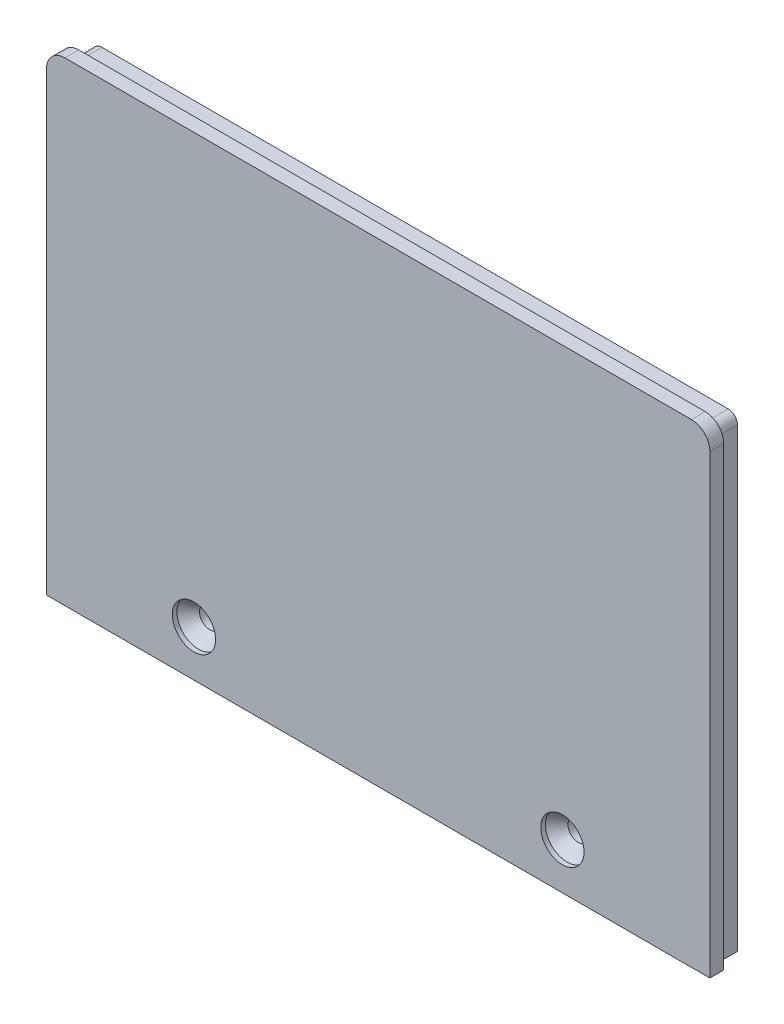
ISO-10303-21;
HEADER;
FILE_DESCRIPTION(('STEP AP214'),'2;1');
FILE_NAME('part.step','',(''),(''),'','','');
FILE_SCHEMA(('AUTOMOTIVE_DESIGN { 1 0 10303 214 1 1 1 1 }'));
ENDSEC;
DATA;
#1=APPLICATION_CONTEXT('core data for automotive mechanical design processes');
#2=APPLICATION_PROTOCOL_DEFINITION('international standard','automotive_design',2000,#1);
#3=PRODUCT_CONTEXT('',#1,'mechanical');
#4=PRODUCT('Part','Part','',(#3));
#5=PRODUCT_RELATED_PRODUCT_CATEGORY('part','',(#4));
#6=PRODUCT_DEFINITION_FORMATION('','',#4);
#7=PRODUCT_DEFINITION_CONTEXT('part definition',#1,'design');
#8=PRODUCT_DEFINITION('design','',#6,#7);
#9=PRODUCT_DEFINITION_SHAPE('','',#8);
#10=(LENGTH_UNIT() NAMED_UNIT(*) SI_UNIT(.MILLI.,.METRE.));
#11=(NAMED_UNIT(*) PLANE_ANGLE_UNIT() SI_UNIT($,.RADIAN.));
#12=(NAMED_UNIT(*) SI_UNIT($,.STERADIAN.) SOLID_ANGLE_UNIT());
#13=UNCERTAINTY_MEASURE_WITH_UNIT(LENGTH_MEASURE(1.E-05),#10,'distance_accuracy_value','');
#14=(GEOMETRIC_REPRESENTATION_CONTEXT(3) GLOBAL_UNCERTAINTY_ASSIGNED_CONTEXT((#13)) GLOBAL_UNIT_ASSIGNED_CONTEXT((#10,
#11,#12)) REPRESENTATION_CONTEXT('',''));
#15=CARTESIAN_POINT('',(0.,0.,0.));
#16=DIRECTION('',(0.,0.,1.));
#17=DIRECTION('',(1.,0.,0.));
#18=AXIS2_PLACEMENT_3D('',#15,#16,#17);
#19=CARTESIAN_POINT('',(70.,0.,8.));
#20=DIRECTION('',(-1.,0.,0.));
#21=DIRECTION('',(0.,0.,1.));
#22=AXIS2_PLACEMENT_3D('',#19,#20,#21);
#23=PLANE('',#22);
#24=DIRECTION('',(0.,1.,0.));
#25=VECTOR('',#24,1.);
#26=CARTESIAN_POINT('',(70.,0.,5.));
#27=LINE('',#26,#25);
#28=CARTESIAN_POINT('',(70.,0.,5.));
#29=VERTEX_POINT('',#28);
#30=CARTESIAN_POINT('',(70.,99.,5.));
#31=VERTEX_POINT('',#30);
#32=EDGE_CURVE('E190',#29,#31,#27,.T.);
#33=ORIENTED_EDGE('',*,*,#32,.F.);
#34=DIRECTION('',(0.,0.,-1.));
#35=VECTOR('',#34,1.);
#36=CARTESIAN_POINT('',(70.,0.,8.));
#37=LINE('',#36,#35);
#38=CARTESIAN_POINT('',(70.,0.,0.));
#39=VERTEX_POINT('',#38);
#40=EDGE_CURVE('E40',#29,#39,#37,.T.);
#41=ORIENTED_EDGE('',*,*,#40,.T.);
#42=DIRECTION('',(0.,1.,0.));
#43=VECTOR('',#42,1.);
#44=CARTESIAN_POINT('',(70.,0.,0.));
#45=LINE('',#44,#43);
#46=CARTESIAN_POINT('',(70.,99.,0.));
#47=VERTEX_POINT('',#46);
#48=EDGE_CURVE('E197',#39,#47,#45,.T.);
#49=ORIENTED_EDGE('',*,*,#48,.T.);
#50=DIRECTION('',(0.,0.,-1.));
#51=VECTOR('',#50,1.);
#52=CARTESIAN_POINT('',(70.,99.,8.));
#53=LINE('',#52,#51);
#54=EDGE_CURVE('E215',#31,#47,#53,.T.);
#55=ORIENTED_EDGE('',*,*,#54,.F.);
#56=EDGE_LOOP('',(#33,#41,#49,#55));
#57=FACE_BOUND('',#56,.T.);
#58=ADVANCED_FACE('F32',(#57),#23,.F.);
#59=CARTESIAN_POINT('',(68.,99.,8.));
#60=DIRECTION('',(0.,0.,-1.));
#61=DIRECTION('',(-1.,0.,0.));
#62=AXIS2_PLACEMENT_3D('',#59,#60,#61);
#63=CYLINDRICAL_SURFACE('',#62,2.);
#64=CARTESIAN_POINT('',(68.,99.,5.));
#65=DIRECTION('',(0.,0.,1.));
#66=DIRECTION('',(1.,0.,0.));
#67=AXIS2_PLACEMENT_3D('',#64,#65,#66);
#68=CIRCLE('',#67,2.);
#69=CARTESIAN_POINT('',(68.,101.,5.));
#70=VERTEX_POINT('',#69);
#71=EDGE_CURVE('E188',#31,#70,#68,.T.);
#72=ORIENTED_EDGE('',*,*,#71,.F.);
#73=ORIENTED_EDGE('',*,*,#54,.T.);
#74=CARTESIAN_POINT('',(68.,99.,0.));
#75=DIRECTION('',(0.,0.,1.));
#76=DIRECTION('',(1.,0.,0.));
#77=AXIS2_PLACEMENT_3D('',#74,#75,#76);
#78=CIRCLE('',#77,2.);
#79=CARTESIAN_POINT('',(68.,101.,0.));
#80=VERTEX_POINT('',#79);
#81=EDGE_CURVE('E200',#47,#80,#78,.T.);
#82=ORIENTED_EDGE('',*,*,#81,.T.);
#83=DIRECTION('',(0.,0.,-1.));
#84=VECTOR('',#83,1.);
#85=CARTESIAN_POINT('',(68.,101.,8.));
#86=LINE('',#85,#84);
#87=EDGE_CURVE('E213',#70,#80,#86,.T.);
#88=ORIENTED_EDGE('',*,*,#87,.F.);
#89=EDGE_LOOP('',(#72,#73,#82,#88));
#90=FACE_BOUND('',#89,.T.);
#91=ADVANCED_FACE('F239',(#90),#63,.T.);
#92=CARTESIAN_POINT('',(68.,101.,8.));
#93=DIRECTION('',(0.,-1.,0.));
#94=DIRECTION('',(0.,0.,-1.));
#95=AXIS2_PLACEMENT_3D('',#92,#93,#94);
#96=PLANE('',#95);
#97=DIRECTION('',(-1.,0.,0.));
#98=VECTOR('',#97,1.);
#99=CARTESIAN_POINT('',(68.,101.,5.));
#100=LINE('',#99,#98);
#101=CARTESIAN_POINT('',(-68.,101.,5.));
#102=VERTEX_POINT('',#101);
#103=EDGE_CURVE('E186',#70,#102,#100,.T.);
#104=ORIENTED_EDGE('',*,*,#103,.F.);
#105=ORIENTED_EDGE('',*,*,#87,.T.);
#106=DIRECTION('',(-1.,0.,0.));
#107=VECTOR('',#106,1.);
#108=CARTESIAN_POINT('',(68.,101.,0.));
#109=LINE('',#108,#107);
#110=CARTESIAN_POINT('',(-68.,101.,0.));
#111=VERTEX_POINT('',#110);
#112=EDGE_CURVE('E203',#80,#111,#109,.T.);
#113=ORIENTED_EDGE('',*,*,#112,.T.);
#114=DIRECTION('',(0.,0.,-1.));
#115=VECTOR('',#114,1.);
#116=CARTESIAN_POINT('',(-68.,101.,8.));
#117=LINE('',#116,#115);
#118=EDGE_CURVE('E211',#102,#111,#117,.T.);
#119=ORIENTED_EDGE('',*,*,#118,.F.);
#120=EDGE_LOOP('',(#104,#105,#113,#119));
#121=FACE_BOUND('',#120,.T.);
#122=ADVANCED_FACE('F243',(#121),#96,.F.);
#123=CARTESIAN_POINT('',(-68.,99.,8.));
#124=DIRECTION('',(0.,0.,-1.));
#125=DIRECTION('',(-1.,0.,0.));
#126=AXIS2_PLACEMENT_3D('',#123,#124,#125);
#127=CYLINDRICAL_SURFACE('',#126,2.);
#128=CARTESIAN_POINT('',(-68.,99.,5.));
#129=DIRECTION('',(0.,0.,1.));
#130=DIRECTION('',(1.,0.,0.));
#131=AXIS2_PLACEMENT_3D('',#128,#129,#130);
#132=CIRCLE('',#131,2.);
#133=CARTESIAN_POINT('',(-70.,99.,5.));
#134=VERTEX_POINT('',#133);
#135=EDGE_CURVE('E175',#102,#134,#132,.T.);
#136=ORIENTED_EDGE('',*,*,#135,.F.);
#137=ORIENTED_EDGE('',*,*,#118,.T.);
#138=CARTESIAN_POINT('',(-68.,99.,0.));
#139=DIRECTION('',(0.,0.,1.));
#140=DIRECTION('',(1.,0.,0.));
#141=AXIS2_PLACEMENT_3D('',#138,#139,#140);
#142=CIRCLE('',#141,2.);
#143=CARTESIAN_POINT('',(-70.,99.,0.));
#144=VERTEX_POINT('',#143);
#145=EDGE_CURVE('E206',#111,#144,#142,.T.);
#146=ORIENTED_EDGE('',*,*,#145,.T.);
#147=DIRECTION('',(0.,0.,-1.));
#148=VECTOR('',#147,1.);
#149=CARTESIAN_POINT('',(-70.,99.,8.));
#150=LINE('',#149,#148);
#151=EDGE_CURVE('E54',#134,#144,#150,.T.);
#152=ORIENTED_EDGE('',*,*,#151,.F.);
#153=EDGE_LOOP('',(#136,#137,#146,#152));
#154=FACE_BOUND('',#153,.T.);
#155=ADVANCED_FACE('F236',(#154),#127,.T.);
#156=CARTESIAN_POINT('',(-70.,99.,8.));
#157=DIRECTION('',(1.,0.,0.));
#158=DIRECTION('',(0.,0.,-1.));
#159=AXIS2_PLACEMENT_3D('',#156,#157,#158);
#160=PLANE('',#159);
#161=DIRECTION('',(0.,-1.,0.));
#162=VECTOR('',#161,1.);
#163=CARTESIAN_POINT('',(-70.,99.,5.));
#164=LINE('',#163,#162);
#165=CARTESIAN_POINT('',(-70.,0.,5.));
#166=VERTEX_POINT('',#165);
#167=EDGE_CURVE('E11',#134,#166,#164,.T.);
#168=ORIENTED_EDGE('',*,*,#167,.F.);
#169=ORIENTED_EDGE('',*,*,#151,.T.);
#170=DIRECTION('',(0.,-1.,0.));
#171=VECTOR('',#170,1.);
#172=CARTESIAN_POINT('',(-70.,99.,0.));
#173=LINE('',#172,#171);
#174=CARTESIAN_POINT('',(-70.,0.,0.));
#175=VERTEX_POINT('',#174);
#176=EDGE_CURVE('E195',#144,#175,#173,.T.);
#177=ORIENTED_EDGE('',*,*,#176,.T.);
#178=DIRECTION('',(0.,0.,-1.));
#179=VECTOR('',#178,1.);
#180=CARTESIAN_POINT('',(-70.,0.,8.));
#181=LINE('',#180,#179);
#182=EDGE_CURVE('E47',#166,#175,#181,.T.);
#183=ORIENTED_EDGE('',*,*,#182,.F.);
#184=EDGE_LOOP('',(#168,#169,#177,#183));
#185=FACE_BOUND('',#184,.T.);
#186=ADVANCED_FACE('F229',(#185),#160,.F.);
#187=CARTESIAN_POINT('',(-70.,0.,8.));
#188=DIRECTION('',(0.,1.,0.));
#189=DIRECTION('',(0.,0.,1.));
#190=AXIS2_PLACEMENT_3D('',#187,#188,#189);
#191=PLANE('',#190);
#192=DIRECTION('',(1.,0.,0.));
#193=VECTOR('',#192,1.);
#194=CARTESIAN_POINT('',(-70.,0.,8.));
#195=LINE('',#194,#193);
#196=CARTESIAN_POINT('',(-72.,0.,8.));
#197=VERTEX_POINT('',#196);
#198=CARTESIAN_POINT('',(72.,0.,8.));
#199=VERTEX_POINT('',#198);
#200=EDGE_CURVE('E193',#197,#199,#195,.T.);
#201=ORIENTED_EDGE('',*,*,#200,.F.);
#202=DIRECTION('',(0.,0.,1.));
#203=VECTOR('',#202,1.);
#204=CARTESIAN_POINT('',(-72.,0.,5.));
#205=LINE('',#204,#203);
#206=CARTESIAN_POINT('',(-72.,0.,5.));
#207=VERTEX_POINT('',#206);
#208=EDGE_CURVE('E179',#207,#197,#205,.T.);
#209=ORIENTED_EDGE('',*,*,#208,.F.);
#210=DIRECTION('',(1.,0.,0.));
#211=VECTOR('',#210,1.);
#212=CARTESIAN_POINT('',(-72.,0.,5.));
#213=LINE('',#212,#211);
#214=EDGE_CURVE('E163',#207,#166,#213,.T.);
#215=ORIENTED_EDGE('',*,*,#214,.T.);
#216=ORIENTED_EDGE('',*,*,#182,.T.);
#217=DIRECTION('',(1.,0.,0.));
#218=VECTOR('',#217,1.);
#219=CARTESIAN_POINT('',(-70.,0.,0.));
#220=LINE('',#219,#218);
#221=EDGE_CURVE('E192',#175,#39,#220,.T.);
#222=ORIENTED_EDGE('',*,*,#221,.T.);
#223=ORIENTED_EDGE('',*,*,#40,.F.);
#224=CARTESIAN_POINT('',(72.,0.,5.));
#225=VERTEX_POINT('',#224);
#226=EDGE_CURVE('E162',#29,#225,#213,.T.);
#227=ORIENTED_EDGE('',*,*,#226,.T.);
#228=DIRECTION('',(0.,0.,1.));
#229=VECTOR('',#228,1.);
#230=CARTESIAN_POINT('',(72.,0.,5.));
#231=LINE('',#230,#229);
#232=EDGE_CURVE('E176',#225,#199,#231,.T.);
#233=ORIENTED_EDGE('',*,*,#232,.T.);
#234=EDGE_LOOP('',(#201,#209,#215,#216,#222,#223,#227,#233));
#235=FACE_BOUND('',#234,.T.);
#236=ADVANCED_FACE('F34',(#235),#191,.F.);
#237=CARTESIAN_POINT('',(68.,99.,8.));
#238=DIRECTION('',(0.,0.,1.));
#239=DIRECTION('',(1.,0.,0.));
#240=AXIS2_PLACEMENT_3D('',#237,#238,#239);
#241=PLANE('',#240);
#242=CARTESIAN_POINT('',(-40.,10.,8.));
#243=DIRECTION('',(0.,0.,1.));
#244=DIRECTION('',(1.,0.,0.));
#245=AXIS2_PLACEMENT_3D('',#242,#243,#244);
#246=CIRCLE('',#245,4.7);
#247=CARTESIAN_POINT('',(-35.3,10.,8.));
#248=VERTEX_POINT('',#247);
#249=EDGE_CURVE('E305',#248,#248,#246,.T.);
#250=ORIENTED_EDGE('',*,*,#249,.F.);
#251=EDGE_LOOP('',(#250));
#252=FACE_BOUND('',#251,.T.);
#253=CARTESIAN_POINT('',(40.,10.,8.));
#254=DIRECTION('',(0.,0.,1.));
#255=DIRECTION('',(1.,0.,0.));
#256=AXIS2_PLACEMENT_3D('',#253,#254,#255);
#257=CIRCLE('',#256,4.7);
#258=CARTESIAN_POINT('',(44.7,10.,8.));
#259=VERTEX_POINT('',#258);
#260=EDGE_CURVE('E315',#259,#259,#257,.T.);
#261=ORIENTED_EDGE('',*,*,#260,.F.);
#262=EDGE_LOOP('',(#261));
#263=FACE_BOUND('',#262,.T.);
#264=ORIENTED_EDGE('',*,*,#200,.T.);
#265=DIRECTION('',(0.,1.,0.));
#266=VECTOR('',#265,1.);
#267=CARTESIAN_POINT('',(72.,0.,8.));
#268=LINE('',#267,#266);
#269=CARTESIAN_POINT('',(72.,99.,8.));
#270=VERTEX_POINT('',#269);
#271=EDGE_CURVE('E149',#199,#270,#268,.T.);
#272=ORIENTED_EDGE('',*,*,#271,.T.);
#273=CARTESIAN_POINT('',(68.,99.,8.));
#274=DIRECTION('',(0.,0.,1.));
#275=DIRECTION('',(1.,0.,0.));
#276=AXIS2_PLACEMENT_3D('',#273,#274,#275);
#277=CIRCLE('',#276,4.);
#278=CARTESIAN_POINT('',(68.,103.,8.));
#279=VERTEX_POINT('',#278);
#280=EDGE_CURVE('E166',#270,#279,#277,.T.);
#281=ORIENTED_EDGE('',*,*,#280,.T.);
#282=DIRECTION('',(-1.,0.,0.));
#283=VECTOR('',#282,1.);
#284=CARTESIAN_POINT('',(68.,103.,8.));
#285=LINE('',#284,#283);
#286=CARTESIAN_POINT('',(-68.,103.,8.));
#287=VERTEX_POINT('',#286);
#288=EDGE_CURVE('E128',#279,#287,#285,.T.);
#289=ORIENTED_EDGE('',*,*,#288,.T.);
#290=CARTESIAN_POINT('',(-68.,99.,8.));
#291=DIRECTION('',(0.,0.,1.));
#292=DIRECTION('',(1.,0.,0.));
#293=AXIS2_PLACEMENT_3D('',#290,#291,#292);
#294=CIRCLE('',#293,4.);
#295=CARTESIAN_POINT('',(-72.,99.,8.));
#296=VERTEX_POINT('',#295);
#297=EDGE_CURVE('E169',#287,#296,#294,.T.);
#298=ORIENTED_EDGE('',*,*,#297,.T.);
#299=DIRECTION('',(0.,-1.,0.));
#300=VECTOR('',#299,1.);
#301=CARTESIAN_POINT('',(-72.,99.,8.));
#302=LINE('',#301,#300);
#303=EDGE_CURVE('E152',#296,#197,#302,.T.);
#304=ORIENTED_EDGE('',*,*,#303,.T.);
#305=EDGE_LOOP('',(#264,#272,#281,#289,#298,#304));
#306=FACE_BOUND('',#305,.T.);
#307=ADVANCED_FACE('F228',(#252,#263,#306),#241,.T.);
#308=CARTESIAN_POINT('',(68.,99.,0.));
#309=DIRECTION('',(0.,0.,1.));
#310=DIRECTION('',(1.,0.,0.));
#311=AXIS2_PLACEMENT_3D('',#308,#309,#310);
#312=PLANE('',#311);
#313=CARTESIAN_POINT('',(-40.,10.,0.));
#314=DIRECTION('',(0.,0.,1.));
#315=DIRECTION('',(1.,0.,0.));
#316=AXIS2_PLACEMENT_3D('',#313,#314,#315);
#317=CIRCLE('',#316,2.25);
#318=CARTESIAN_POINT('',(-37.75,10.,0.));
#319=VERTEX_POINT('',#318);
#320=EDGE_CURVE('E312',#319,#319,#317,.T.);
#321=ORIENTED_EDGE('',*,*,#320,.T.);
#322=EDGE_LOOP('',(#321));
#323=FACE_BOUND('',#322,.T.);
#324=CARTESIAN_POINT('',(40.,10.,0.));
#325=DIRECTION('',(0.,0.,1.));
#326=DIRECTION('',(1.,0.,0.));
#327=AXIS2_PLACEMENT_3D('',#324,#325,#326);
#328=CIRCLE('',#327,2.25);
#329=CARTESIAN_POINT('',(42.25,10.,0.));
#330=VERTEX_POINT('',#329);
#331=EDGE_CURVE('E155',#330,#330,#328,.T.);
#332=ORIENTED_EDGE('',*,*,#331,.T.);
#333=EDGE_LOOP('',(#332));
#334=FACE_BOUND('',#333,.T.);
#335=ORIENTED_EDGE('',*,*,#221,.F.);
#336=ORIENTED_EDGE('',*,*,#176,.F.);
#337=ORIENTED_EDGE('',*,*,#145,.F.);
#338=ORIENTED_EDGE('',*,*,#112,.F.);
#339=ORIENTED_EDGE('',*,*,#81,.F.);
#340=ORIENTED_EDGE('',*,*,#48,.F.);
#341=EDGE_LOOP('',(#335,#336,#337,#338,#339,#340));
#342=FACE_BOUND('',#341,.T.);
#343=ADVANCED_FACE('F224',(#323,#334,#342),#312,.F.);
#344=CARTESIAN_POINT('',(68.,99.,5.));
#345=DIRECTION('',(0.,0.,1.));
#346=DIRECTION('',(1.,0.,0.));
#347=AXIS2_PLACEMENT_3D('',#344,#345,#346);
#348=PLANE('',#347);
#349=ORIENTED_EDGE('',*,*,#226,.F.);
#350=ORIENTED_EDGE('',*,*,#32,.T.);
#351=ORIENTED_EDGE('',*,*,#71,.T.);
#352=ORIENTED_EDGE('',*,*,#103,.T.);
#353=ORIENTED_EDGE('',*,*,#135,.T.);
#354=ORIENTED_EDGE('',*,*,#167,.T.);
#355=ORIENTED_EDGE('',*,*,#214,.F.);
#356=DIRECTION('',(0.,-1.,0.));
#357=VECTOR('',#356,1.);
#358=CARTESIAN_POINT('',(-72.,99.,5.));
#359=LINE('',#358,#357);
#360=CARTESIAN_POINT('',(-72.,99.,5.));
#361=VERTEX_POINT('',#360);
#362=EDGE_CURVE('E159',#361,#207,#359,.T.);
#363=ORIENTED_EDGE('',*,*,#362,.F.);
#364=CARTESIAN_POINT('',(-68.,99.,5.));
#365=DIRECTION('',(0.,0.,1.));
#366=DIRECTION('',(1.,0.,0.));
#367=AXIS2_PLACEMENT_3D('',#364,#365,#366);
#368=CIRCLE('',#367,4.);
#369=CARTESIAN_POINT('',(-68.,103.,5.));
#370=VERTEX_POINT('',#369);
#371=EDGE_CURVE('E145',#370,#361,#368,.T.);
#372=ORIENTED_EDGE('',*,*,#371,.F.);
#373=DIRECTION('',(-1.,0.,0.));
#374=VECTOR('',#373,1.);
#375=CARTESIAN_POINT('',(68.,103.,5.));
#376=LINE('',#375,#374);
#377=CARTESIAN_POINT('',(68.,103.,5.));
#378=VERTEX_POINT('',#377);
#379=EDGE_CURVE('E126',#378,#370,#376,.T.);
#380=ORIENTED_EDGE('',*,*,#379,.F.);
#381=CARTESIAN_POINT('',(68.,99.,5.));
#382=DIRECTION('',(0.,0.,1.));
#383=DIRECTION('',(1.,0.,0.));
#384=AXIS2_PLACEMENT_3D('',#381,#382,#383);
#385=CIRCLE('',#384,4.);
#386=CARTESIAN_POINT('',(72.,99.,5.));
#387=VERTEX_POINT('',#386);
#388=EDGE_CURVE('E141',#387,#378,#385,.T.);
#389=ORIENTED_EDGE('',*,*,#388,.F.);
#390=DIRECTION('',(0.,1.,0.));
#391=VECTOR('',#390,1.);
#392=CARTESIAN_POINT('',(72.,0.,5.));
#393=LINE('',#392,#391);
#394=EDGE_CURVE('E134',#225,#387,#393,.T.);
#395=ORIENTED_EDGE('',*,*,#394,.F.);
#396=EDGE_LOOP('',(#349,#350,#351,#352,#353,#354,#355,#363,#372,#380,#389,#395));
#397=FACE_BOUND('',#396,.T.);
#398=ADVANCED_FACE('F139',(#397),#348,.F.);
#399=CARTESIAN_POINT('',(68.,99.,5.));
#400=DIRECTION('',(0.,0.,1.));
#401=DIRECTION('',(1.,0.,0.));
#402=AXIS2_PLACEMENT_3D('',#399,#400,#401);
#403=CYLINDRICAL_SURFACE('',#402,4.);
#404=ORIENTED_EDGE('',*,*,#280,.F.);
#405=DIRECTION('',(0.,0.,1.));
#406=VECTOR('',#405,1.);
#407=CARTESIAN_POINT('',(72.,99.,5.));
#408=LINE('',#407,#406);
#409=EDGE_CURVE('E148',#387,#270,#408,.T.);
#410=ORIENTED_EDGE('',*,*,#409,.F.);
#411=ORIENTED_EDGE('',*,*,#388,.T.);
#412=DIRECTION('',(0.,0.,1.));
#413=VECTOR('',#412,1.);
#414=CARTESIAN_POINT('',(68.,103.,5.));
#415=LINE('',#414,#413);
#416=EDGE_CURVE('E123',#378,#279,#415,.T.);
#417=ORIENTED_EDGE('',*,*,#416,.T.);
#418=EDGE_LOOP('',(#404,#410,#411,#417));
#419=FACE_BOUND('',#418,.T.);
#420=ADVANCED_FACE('F147',(#419),#403,.T.);
#421=CARTESIAN_POINT('',(72.,0.,5.));
#422=DIRECTION('',(1.,0.,0.));
#423=DIRECTION('',(0.,0.,-1.));
#424=AXIS2_PLACEMENT_3D('',#421,#422,#423);
#425=PLANE('',#424);
#426=ORIENTED_EDGE('',*,*,#271,.F.);
#427=ORIENTED_EDGE('',*,*,#232,.F.);
#428=ORIENTED_EDGE('',*,*,#394,.T.);
#429=ORIENTED_EDGE('',*,*,#409,.T.);
#430=EDGE_LOOP('',(#426,#427,#428,#429));
#431=FACE_BOUND('',#430,.T.);
#432=ADVANCED_FACE('F258',(#431),#425,.T.);
#433=CARTESIAN_POINT('',(-72.,99.,5.));
#434=DIRECTION('',(-1.,0.,0.));
#435=DIRECTION('',(0.,0.,1.));
#436=AXIS2_PLACEMENT_3D('',#433,#434,#435);
#437=PLANE('',#436);
#438=ORIENTED_EDGE('',*,*,#303,.F.);
#439=DIRECTION('',(0.,0.,1.));
#440=VECTOR('',#439,1.);
#441=CARTESIAN_POINT('',(-72.,99.,5.));
#442=LINE('',#441,#440);
#443=EDGE_CURVE('E182',#361,#296,#442,.T.);
#444=ORIENTED_EDGE('',*,*,#443,.F.);
#445=ORIENTED_EDGE('',*,*,#362,.T.);
#446=ORIENTED_EDGE('',*,*,#208,.T.);
#447=EDGE_LOOP('',(#438,#444,#445,#446));
#448=FACE_BOUND('',#447,.T.);
#449=ADVANCED_FACE('F265',(#448),#437,.T.);
#450=CARTESIAN_POINT('',(-68.,99.,5.));
#451=DIRECTION('',(0.,0.,1.));
#452=DIRECTION('',(1.,0.,0.));
#453=AXIS2_PLACEMENT_3D('',#450,#451,#452);
#454=CYLINDRICAL_SURFACE('',#453,4.);
#455=ORIENTED_EDGE('',*,*,#297,.F.);
#456=DIRECTION('',(0.,0.,1.));
#457=VECTOR('',#456,1.);
#458=CARTESIAN_POINT('',(-68.,103.,5.));
#459=LINE('',#458,#457);
#460=EDGE_CURVE('E133',#370,#287,#459,.T.);
#461=ORIENTED_EDGE('',*,*,#460,.F.);
#462=ORIENTED_EDGE('',*,*,#371,.T.);
#463=ORIENTED_EDGE('',*,*,#443,.T.);
#464=EDGE_LOOP('',(#455,#461,#462,#463));
#465=FACE_BOUND('',#464,.T.);
#466=ADVANCED_FACE('F262',(#465),#454,.T.);
#467=CARTESIAN_POINT('',(68.,103.,5.));
#468=DIRECTION('',(0.,1.,0.));
#469=DIRECTION('',(0.,0.,1.));
#470=AXIS2_PLACEMENT_3D('',#467,#468,#469);
#471=PLANE('',#470);
#472=ORIENTED_EDGE('',*,*,#288,.F.);
#473=ORIENTED_EDGE('',*,*,#416,.F.);
#474=ORIENTED_EDGE('',*,*,#379,.T.);
#475=ORIENTED_EDGE('',*,*,#460,.T.);
#476=EDGE_LOOP('',(#472,#473,#474,#475));
#477=FACE_BOUND('',#476,.T.);
#478=ADVANCED_FACE('F125',(#477),#471,.T.);
#479=CARTESIAN_POINT('',(40.,10.,8.));
#480=DIRECTION('',(0.,0.,1.));
#481=DIRECTION('',(1.,0.,0.));
#482=AXIS2_PLACEMENT_3D('',#479,#480,#481);
#483=CYLINDRICAL_SURFACE('',#482,2.25);
#484=ORIENTED_EDGE('',*,*,#331,.F.);
#485=EDGE_LOOP('',(#484));
#486=FACE_BOUND('',#485,.T.);
#487=CARTESIAN_POINT('',(40.,10.,4.55000000000049));
#488=DIRECTION('',(0.,0.,1.));
#489=DIRECTION('',(1.,0.,0.));
#490=AXIS2_PLACEMENT_3D('',#487,#488,#489);
#491=CIRCLE('',#490,2.25);
#492=CARTESIAN_POINT('',(42.25,10.,4.55000000000049));
#493=VERTEX_POINT('',#492);
#494=EDGE_CURVE('E320',#493,#493,#491,.T.);
#495=ORIENTED_EDGE('',*,*,#494,.T.);
#496=EDGE_LOOP('',(#495));
#497=FACE_BOUND('',#496,.T.);
#498=ADVANCED_FACE('F261',(#486,#497),#483,.F.);
#499=CARTESIAN_POINT('',(40.,10.,7.00000000000011));
#500=DIRECTION('',(0.,0.,1.));
#501=DIRECTION('',(1.,0.,0.));
#502=AXIS2_PLACEMENT_3D('',#499,#500,#501);
#503=CONICAL_SURFACE('',#502,4.69999999999975,0.785398163397474);
#504=ORIENTED_EDGE('',*,*,#494,.F.);
#505=EDGE_LOOP('',(#504));
#506=FACE_BOUND('',#505,.T.);
#507=CARTESIAN_POINT('',(40.,10.,7.00000000000011));
#508=DIRECTION('',(0.,0.,1.));
#509=DIRECTION('',(1.,0.,0.));
#510=AXIS2_PLACEMENT_3D('',#507,#508,#509);
#511=CIRCLE('',#510,4.69999999999975);
#512=CARTESIAN_POINT('',(44.6999999999997,10.,7.00000000000011));
#513=VERTEX_POINT('',#512);
#514=EDGE_CURVE('E318',#513,#513,#511,.T.);
#515=ORIENTED_EDGE('',*,*,#514,.T.);
#516=EDGE_LOOP('',(#515));
#517=FACE_BOUND('',#516,.T.);
#518=ADVANCED_FACE('F277',(#506,#517),#503,.F.);
#519=CARTESIAN_POINT('',(40.,10.,8.));
#520=DIRECTION('',(0.,0.,1.));
#521=DIRECTION('',(1.,0.,0.));
#522=AXIS2_PLACEMENT_3D('',#519,#520,#521);
#523=CYLINDRICAL_SURFACE('',#522,4.69999999999987);
#524=ORIENTED_EDGE('',*,*,#514,.F.);
#525=EDGE_LOOP('',(#524));
#526=FACE_BOUND('',#525,.T.);
#527=ORIENTED_EDGE('',*,*,#260,.T.);
#528=EDGE_LOOP('',(#527));
#529=FACE_BOUND('',#528,.T.);
#530=ADVANCED_FACE('F281',(#526,#529),#523,.F.);
#531=CARTESIAN_POINT('',(-40.,10.,8.));
#532=DIRECTION('',(0.,0.,1.));
#533=DIRECTION('',(1.,0.,0.));
#534=AXIS2_PLACEMENT_3D('',#531,#532,#533);
#535=CYLINDRICAL_SURFACE('',#534,2.25);
#536=ORIENTED_EDGE('',*,*,#320,.F.);
#537=EDGE_LOOP('',(#536));
#538=FACE_BOUND('',#537,.T.);
#539=CARTESIAN_POINT('',(-40.,10.,4.55000000000049));
#540=DIRECTION('',(0.,0.,1.));
#541=DIRECTION('',(1.,0.,0.));
#542=AXIS2_PLACEMENT_3D('',#539,#540,#541);
#543=CIRCLE('',#542,2.25);
#544=CARTESIAN_POINT('',(-37.75,10.,4.55000000000049));
#545=VERTEX_POINT('',#544);
#546=EDGE_CURVE('E307',#545,#545,#543,.T.);
#547=ORIENTED_EDGE('',*,*,#546,.T.);
#548=EDGE_LOOP('',(#547));
#549=FACE_BOUND('',#548,.T.);
#550=ADVANCED_FACE('F285',(#538,#549),#535,.F.);
#551=CARTESIAN_POINT('',(-40.,10.,7.00000000000011));
#552=DIRECTION('',(0.,0.,1.));
#553=DIRECTION('',(1.,0.,0.));
#554=AXIS2_PLACEMENT_3D('',#551,#552,#553);
#555=CONICAL_SURFACE('',#554,4.69999999999975,0.785398163397474);
#556=ORIENTED_EDGE('',*,*,#546,.F.);
#557=EDGE_LOOP('',(#556));
#558=FACE_BOUND('',#557,.T.);
#559=CARTESIAN_POINT('',(-40.,10.,7.00000000000011));
#560=DIRECTION('',(0.,0.,1.));
#561=DIRECTION('',(1.,0.,0.));
#562=AXIS2_PLACEMENT_3D('',#559,#560,#561);
#563=CIRCLE('',#562,4.69999999999975);
#564=CARTESIAN_POINT('',(-35.3000000000003,10.,7.00000000000011));
#565=VERTEX_POINT('',#564);
#566=EDGE_CURVE('E302',#565,#565,#563,.T.);
#567=ORIENTED_EDGE('',*,*,#566,.T.);
#568=EDGE_LOOP('',(#567));
#569=FACE_BOUND('',#568,.T.);
#570=ADVANCED_FACE('F289',(#558,#569),#555,.F.);
#571=CARTESIAN_POINT('',(-40.,10.,8.));
#572=DIRECTION('',(0.,0.,1.));
#573=DIRECTION('',(1.,0.,0.));
#574=AXIS2_PLACEMENT_3D('',#571,#572,#573);
#575=CYLINDRICAL_SURFACE('',#574,4.69999999999987);
#576=ORIENTED_EDGE('',*,*,#566,.F.);
#577=EDGE_LOOP('',(#576));
#578=FACE_BOUND('',#577,.T.);
#579=ORIENTED_EDGE('',*,*,#249,.T.);
#580=EDGE_LOOP('',(#579));
#581=FACE_BOUND('',#580,.T.);
#582=ADVANCED_FACE('F293',(#578,#581),#575,.F.);
#583=CLOSED_SHELL('',(#58,#91,#122,#155,#186,#236,#307,#343,#398,#420,#432,#449,#466,#478,#498,
#518,#530,#550,#570,#582));
#584=MANIFOLD_SOLID_BREP('B2',#583);
#585=ADVANCED_BREP_SHAPE_REPRESENTATION('',(#18,#584),#14);
#586=SHAPE_DEFINITION_REPRESENTATION(#9,#585);
ENDSEC;
END-ISO-10303-21;
